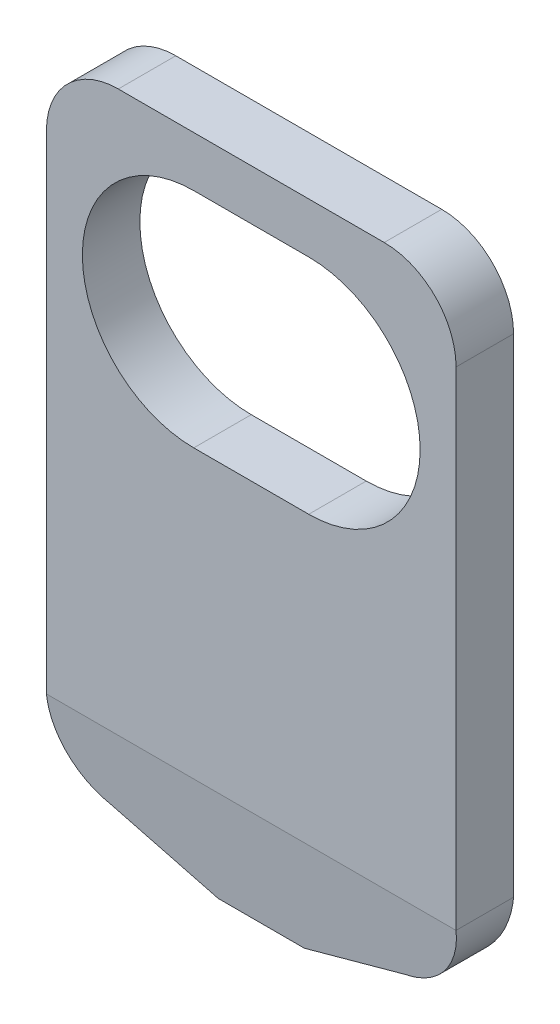
ISO-10303-21;
HEADER;
FILE_DESCRIPTION(('STEP AP214'),'2;1');
FILE_NAME('part.step','',(''),(''),'','','');
FILE_SCHEMA(('AUTOMOTIVE_DESIGN { 1 0 10303 214 1 1 1 1 }'));
ENDSEC;
DATA;
#1=APPLICATION_CONTEXT('core data for automotive mechanical design processes');
#2=APPLICATION_PROTOCOL_DEFINITION('international standard','automotive_design',2000,#1);
#3=PRODUCT_CONTEXT('',#1,'mechanical');
#4=PRODUCT('Part','Part','',(#3));
#5=PRODUCT_RELATED_PRODUCT_CATEGORY('part','',(#4));
#6=PRODUCT_DEFINITION_FORMATION('','',#4);
#7=PRODUCT_DEFINITION_CONTEXT('part definition',#1,'design');
#8=PRODUCT_DEFINITION('design','',#6,#7);
#9=PRODUCT_DEFINITION_SHAPE('','',#8);
#10=(LENGTH_UNIT() NAMED_UNIT(*) SI_UNIT(.MILLI.,.METRE.));
#11=(NAMED_UNIT(*) PLANE_ANGLE_UNIT() SI_UNIT($,.RADIAN.));
#12=(NAMED_UNIT(*) SI_UNIT($,.STERADIAN.) SOLID_ANGLE_UNIT());
#13=UNCERTAINTY_MEASURE_WITH_UNIT(LENGTH_MEASURE(1.E-05),#10,'distance_accuracy_value','');
#14=(GEOMETRIC_REPRESENTATION_CONTEXT(3) GLOBAL_UNCERTAINTY_ASSIGNED_CONTEXT((#13)) GLOBAL_UNIT_ASSIGNED_CONTEXT((#10,
#11,#12)) REPRESENTATION_CONTEXT('',''));
#15=CARTESIAN_POINT('',(0.,0.,0.));
#16=DIRECTION('',(0.,0.,1.));
#17=DIRECTION('',(1.,0.,0.));
#18=AXIS2_PLACEMENT_3D('',#15,#16,#17);
#19=CARTESIAN_POINT('',(5.,7.05077941637888,4.));
#20=DIRECTION('',(0.,0.,-1.));
#21=DIRECTION('',(-1.,0.,0.));
#22=AXIS2_PLACEMENT_3D('',#19,#20,#21);
#23=CYLINDRICAL_SURFACE('',#22,5.);
#24=DIRECTION('',(0.,0.,-1.));
#25=VECTOR('',#24,1.);
#26=CARTESIAN_POINT('',(0.,7.05077941637888,4.));
#27=LINE('',#26,#25);
#28=CARTESIAN_POINT('',(0.,7.05077941637888,4.));
#29=VERTEX_POINT('',#28);
#30=CARTESIAN_POINT('',(0.,7.05077941637888,0.));
#31=VERTEX_POINT('',#30);
#32=EDGE_CURVE('E245',#29,#31,#27,.T.);
#33=ORIENTED_EDGE('',*,*,#32,.T.);
#34=CARTESIAN_POINT('',(5.,7.05077941637888,0.));
#35=DIRECTION('',(0.,0.0987941169734353,0.995107894879464));
#36=DIRECTION('',(0.,0.995107894879464,-0.0987941169734353));
#37=AXIS2_PLACEMENT_3D('',#34,#35,#36);
#38=ELLIPSE('',#37,5.02458077734942,5.);
#39=CARTESIAN_POINT('',(3.96263798515156,2.15957506058372,0.48559781080416));
#40=VERTEX_POINT('',#39);
#41=EDGE_CURVE('E188',#31,#40,#38,.T.);
#42=ORIENTED_EDGE('',*,*,#41,.T.);
#43=DIRECTION('',(0.,0.,-1.));
#44=VECTOR('',#43,1.);
#45=CARTESIAN_POINT('',(3.96263798515156,2.15957506058372,4.));
#46=LINE('',#45,#44);
#47=CARTESIAN_POINT('',(3.96263798515156,2.15957506058372,3.51440218919584));
#48=VERTEX_POINT('',#47);
#49=EDGE_CURVE('E12',#48,#40,#46,.T.);
#50=ORIENTED_EDGE('',*,*,#49,.F.);
#51=CARTESIAN_POINT('',(5.,7.05077941637888,4.));
#52=DIRECTION('',(0.,0.0987941169734353,-0.995107894879464));
#53=DIRECTION('',(0.,-0.995107894879464,-0.0987941169734353));
#54=AXIS2_PLACEMENT_3D('',#51,#52,#53);
#55=ELLIPSE('',#54,5.02458077734942,5.);
#56=EDGE_CURVE('E296',#48,#29,#55,.T.);
#57=ORIENTED_EDGE('',*,*,#56,.T.);
#58=EDGE_LOOP('',(#33,#42,#50,#57));
#59=FACE_BOUND('',#58,.T.);
#60=ADVANCED_FACE('F81',(#59),#23,.T.);
#61=CARTESIAN_POINT('',(3.96263798515156,2.15957506058372,4.));
#62=DIRECTION('',(0.284131470503692,0.958785329189704,0.));
#63=DIRECTION('',(-0.958785329189704,0.284131470503692,0.));
#64=AXIS2_PLACEMENT_3D('',#61,#62,#63);
#65=PLANE('',#64);
#66=ORIENTED_EDGE('',*,*,#49,.T.);
#67=DIRECTION('',(0.958404094160579,-0.284018493316688,0.0281973004090641));
#68=VECTOR('',#67,1.);
#69=CARTESIAN_POINT('',(4.05761262433786,2.13142977814039,0.488392068934624));
#70=LINE('',#69,#68);
#71=CARTESIAN_POINT('',(11.25,0.,0.7));
#72=VERTEX_POINT('',#71);
#73=EDGE_CURVE('E279',#40,#72,#70,.T.);
#74=ORIENTED_EDGE('',*,*,#73,.T.);
#75=DIRECTION('',(0.,0.,-1.));
#76=VECTOR('',#75,1.);
#77=CARTESIAN_POINT('',(11.25,0.,4.));
#78=LINE('',#77,#76);
#79=CARTESIAN_POINT('',(11.25,0.,3.3));
#80=VERTEX_POINT('',#79);
#81=EDGE_CURVE('E89',#80,#72,#78,.T.);
#82=ORIENTED_EDGE('',*,*,#81,.F.);
#83=DIRECTION('',(-0.958404094160579,0.284018493316688,0.0281973004090642));
#84=VECTOR('',#83,1.);
#85=CARTESIAN_POINT('',(3.94951499171257,2.16346399725152,3.51478828206681));
#86=LINE('',#85,#84);
#87=EDGE_CURVE('E277',#80,#48,#86,.T.);
#88=ORIENTED_EDGE('',*,*,#87,.T.);
#89=EDGE_LOOP('',(#66,#74,#82,#88));
#90=FACE_BOUND('',#89,.T.);
#91=ADVANCED_FACE('F276',(#90),#65,.F.);
#92=CARTESIAN_POINT('',(11.25,0.,4.));
#93=DIRECTION('',(0.,1.,0.));
#94=DIRECTION('',(-1.,0.,0.));
#95=AXIS2_PLACEMENT_3D('',#92,#93,#94);
#96=PLANE('',#95);
#97=ORIENTED_EDGE('',*,*,#81,.T.);
#98=DIRECTION('',(-1.,0.,0.));
#99=VECTOR('',#98,1.);
#100=CARTESIAN_POINT('',(28.5,0.,0.7));
#101=LINE('',#100,#99);
#102=CARTESIAN_POINT('',(17.25,0.,0.7));
#103=VERTEX_POINT('',#102);
#104=EDGE_CURVE('E194',#103,#72,#101,.T.);
#105=ORIENTED_EDGE('',*,*,#104,.F.);
#106=DIRECTION('',(0.,0.,-1.));
#107=VECTOR('',#106,1.);
#108=CARTESIAN_POINT('',(17.25,0.,4.));
#109=LINE('',#108,#107);
#110=CARTESIAN_POINT('',(17.25,0.,3.3));
#111=VERTEX_POINT('',#110);
#112=EDGE_CURVE('E261',#111,#103,#109,.T.);
#113=ORIENTED_EDGE('',*,*,#112,.F.);
#114=DIRECTION('',(-1.,0.,0.));
#115=VECTOR('',#114,1.);
#116=CARTESIAN_POINT('',(28.5,0.,3.3));
#117=LINE('',#116,#115);
#118=EDGE_CURVE('E272',#111,#80,#117,.T.);
#119=ORIENTED_EDGE('',*,*,#118,.T.);
#120=EDGE_LOOP('',(#97,#105,#113,#119));
#121=FACE_BOUND('',#120,.T.);
#122=ADVANCED_FACE('F270',(#121),#96,.F.);
#123=CARTESIAN_POINT('',(17.25,0.,4.));
#124=DIRECTION('',(-0.284131470503692,0.958785329189704,0.));
#125=DIRECTION('',(-0.958785329189704,-0.284131470503692,0.));
#126=AXIS2_PLACEMENT_3D('',#123,#124,#125);
#127=PLANE('',#126);
#128=ORIENTED_EDGE('',*,*,#112,.T.);
#129=DIRECTION('',(0.958404094160579,0.284018493316687,-0.0281973004090641));
#130=VECTOR('',#129,1.);
#131=CARTESIAN_POINT('',(17.1608194530841,-0.0264282307666742,0.702623789576185));
#132=LINE('',#131,#130);
#133=CARTESIAN_POINT('',(24.5373620148484,2.15957506058372,0.48559781080416));
#134=VERTEX_POINT('',#133);
#135=EDGE_CURVE('E207',#103,#134,#132,.T.);
#136=ORIENTED_EDGE('',*,*,#135,.T.);
#137=DIRECTION('',(0.,0.,-1.));
#138=VECTOR('',#137,1.);
#139=CARTESIAN_POINT('',(24.5373620148484,2.15957506058372,4.));
#140=LINE('',#139,#138);
#141=CARTESIAN_POINT('',(24.5373620148484,2.15957506058372,3.51440218919584));
#142=VERTEX_POINT('',#141);
#143=EDGE_CURVE('E205',#142,#134,#140,.T.);
#144=ORIENTED_EDGE('',*,*,#143,.F.);
#145=DIRECTION('',(-0.958404094160579,-0.284018493316687,-0.0281973004090641));
#146=VECTOR('',#145,1.);
#147=CARTESIAN_POINT('',(17.2689170857094,0.00560598834444739,3.30055656142525));
#148=LINE('',#147,#146);
#149=EDGE_CURVE('E290',#142,#111,#148,.T.);
#150=ORIENTED_EDGE('',*,*,#149,.T.);
#151=EDGE_LOOP('',(#128,#136,#144,#150));
#152=FACE_BOUND('',#151,.T.);
#153=ADVANCED_FACE('F390',(#152),#127,.F.);
#154=CARTESIAN_POINT('',(23.5,7.05077941637888,4.));
#155=DIRECTION('',(0.,0.,-1.));
#156=DIRECTION('',(-1.,0.,0.));
#157=AXIS2_PLACEMENT_3D('',#154,#155,#156);
#158=CYLINDRICAL_SURFACE('',#157,5.);
#159=CARTESIAN_POINT('',(23.5,7.05077941637888,0.));
#160=DIRECTION('',(0.,0.0987941169734353,0.995107894879464));
#161=DIRECTION('',(0.,0.995107894879464,-0.0987941169734353));
#162=AXIS2_PLACEMENT_3D('',#159,#160,#161);
#163=ELLIPSE('',#162,5.02458077734942,5.);
#164=CARTESIAN_POINT('',(28.5,7.05077941637888,0.));
#165=VERTEX_POINT('',#164);
#166=EDGE_CURVE('E185',#165,#134,#163,.F.);
#167=ORIENTED_EDGE('',*,*,#166,.F.);
#168=DIRECTION('',(0.,0.,-1.));
#169=VECTOR('',#168,1.);
#170=CARTESIAN_POINT('',(28.5,7.05077941637888,4.));
#171=LINE('',#170,#169);
#172=CARTESIAN_POINT('',(28.5,7.05077941637888,4.));
#173=VERTEX_POINT('',#172);
#174=EDGE_CURVE('E202',#173,#165,#171,.T.);
#175=ORIENTED_EDGE('',*,*,#174,.F.);
#176=CARTESIAN_POINT('',(23.5,7.05077941637888,4.));
#177=DIRECTION('',(0.,0.0987941169734353,-0.995107894879464));
#178=DIRECTION('',(0.,-0.995107894879464,-0.0987941169734353));
#179=AXIS2_PLACEMENT_3D('',#176,#177,#178);
#180=ELLIPSE('',#179,5.02458077734942,5.);
#181=EDGE_CURVE('E284',#142,#173,#180,.F.);
#182=ORIENTED_EDGE('',*,*,#181,.F.);
#183=ORIENTED_EDGE('',*,*,#143,.T.);
#184=EDGE_LOOP('',(#167,#175,#182,#183));
#185=FACE_BOUND('',#184,.T.);
#186=ADVANCED_FACE('F200',(#185),#158,.T.);
#187=CARTESIAN_POINT('',(28.5,7.05077941637888,4.));
#188=DIRECTION('',(-1.,0.,0.));
#189=DIRECTION('',(0.,0.,1.));
#190=AXIS2_PLACEMENT_3D('',#187,#188,#189);
#191=PLANE('',#190);
#192=DIRECTION('',(0.,1.,0.));
#193=VECTOR('',#192,1.);
#194=CARTESIAN_POINT('',(28.5,7.05077941637888,0.));
#195=LINE('',#194,#193);
#196=CARTESIAN_POINT('',(28.5,41.,0.));
#197=VERTEX_POINT('',#196);
#198=EDGE_CURVE('E212',#165,#197,#195,.T.);
#199=ORIENTED_EDGE('',*,*,#198,.T.);
#200=DIRECTION('',(0.,0.,-1.));
#201=VECTOR('',#200,1.);
#202=CARTESIAN_POINT('',(28.5,41.,4.));
#203=LINE('',#202,#201);
#204=CARTESIAN_POINT('',(28.5,41.,4.));
#205=VERTEX_POINT('',#204);
#206=EDGE_CURVE('E216',#205,#197,#203,.T.);
#207=ORIENTED_EDGE('',*,*,#206,.F.);
#208=DIRECTION('',(0.,1.,0.));
#209=VECTOR('',#208,1.);
#210=CARTESIAN_POINT('',(28.5,7.05077941637888,4.));
#211=LINE('',#210,#209);
#212=EDGE_CURVE('E214',#173,#205,#211,.T.);
#213=ORIENTED_EDGE('',*,*,#212,.F.);
#214=ORIENTED_EDGE('',*,*,#174,.T.);
#215=EDGE_LOOP('',(#199,#207,#213,#214));
#216=FACE_BOUND('',#215,.T.);
#217=ADVANCED_FACE('F210',(#216),#191,.F.);
#218=CARTESIAN_POINT('',(23.5,41.,4.));
#219=DIRECTION('',(0.,0.,-1.));
#220=DIRECTION('',(-1.,0.,0.));
#221=AXIS2_PLACEMENT_3D('',#218,#219,#220);
#222=CYLINDRICAL_SURFACE('',#221,5.);
#223=CARTESIAN_POINT('',(23.5,41.,0.));
#224=DIRECTION('',(0.,0.,1.));
#225=DIRECTION('',(1.,0.,0.));
#226=AXIS2_PLACEMENT_3D('',#223,#224,#225);
#227=CIRCLE('',#226,5.);
#228=CARTESIAN_POINT('',(23.5,46.,0.));
#229=VERTEX_POINT('',#228);
#230=EDGE_CURVE('E222',#197,#229,#227,.T.);
#231=ORIENTED_EDGE('',*,*,#230,.T.);
#232=DIRECTION('',(0.,0.,-1.));
#233=VECTOR('',#232,1.);
#234=CARTESIAN_POINT('',(23.5,46.,4.));
#235=LINE('',#234,#233);
#236=CARTESIAN_POINT('',(23.5,46.,4.));
#237=VERTEX_POINT('',#236);
#238=EDGE_CURVE('E254',#237,#229,#235,.T.);
#239=ORIENTED_EDGE('',*,*,#238,.F.);
#240=CARTESIAN_POINT('',(23.5,41.,4.));
#241=DIRECTION('',(0.,0.,1.));
#242=DIRECTION('',(1.,0.,0.));
#243=AXIS2_PLACEMENT_3D('',#240,#241,#242);
#244=CIRCLE('',#243,5.);
#245=EDGE_CURVE('E336',#205,#237,#244,.T.);
#246=ORIENTED_EDGE('',*,*,#245,.F.);
#247=ORIENTED_EDGE('',*,*,#206,.T.);
#248=EDGE_LOOP('',(#231,#239,#246,#247));
#249=FACE_BOUND('',#248,.T.);
#250=ADVANCED_FACE('F374',(#249),#222,.T.);
#251=CARTESIAN_POINT('',(5.,46.,4.));
#252=DIRECTION('',(0.,1.,0.));
#253=DIRECTION('',(0.,0.,1.));
#254=AXIS2_PLACEMENT_3D('',#251,#252,#253);
#255=PLANE('',#254);
#256=DIRECTION('',(1.,0.,0.));
#257=VECTOR('',#256,1.);
#258=CARTESIAN_POINT('',(5.,46.,0.));
#259=LINE('',#258,#257);
#260=CARTESIAN_POINT('',(5.,46.,0.));
#261=VERTEX_POINT('',#260);
#262=EDGE_CURVE('E228',#261,#229,#259,.T.);
#263=ORIENTED_EDGE('',*,*,#262,.F.);
#264=DIRECTION('',(0.,0.,-1.));
#265=VECTOR('',#264,1.);
#266=CARTESIAN_POINT('',(5.,46.,4.));
#267=LINE('',#266,#265);
#268=CARTESIAN_POINT('',(5.,46.,4.));
#269=VERTEX_POINT('',#268);
#270=EDGE_CURVE('E251',#269,#261,#267,.T.);
#271=ORIENTED_EDGE('',*,*,#270,.F.);
#272=DIRECTION('',(1.,0.,0.));
#273=VECTOR('',#272,1.);
#274=CARTESIAN_POINT('',(5.,46.,4.));
#275=LINE('',#274,#273);
#276=EDGE_CURVE('E339',#269,#237,#275,.T.);
#277=ORIENTED_EDGE('',*,*,#276,.T.);
#278=ORIENTED_EDGE('',*,*,#238,.T.);
#279=EDGE_LOOP('',(#263,#271,#277,#278));
#280=FACE_BOUND('',#279,.T.);
#281=ADVANCED_FACE('F365',(#280),#255,.T.);
#282=CARTESIAN_POINT('',(5.,41.,4.));
#283=DIRECTION('',(0.,0.,-1.));
#284=DIRECTION('',(-1.,0.,0.));
#285=AXIS2_PLACEMENT_3D('',#282,#283,#284);
#286=CYLINDRICAL_SURFACE('',#285,5.);
#287=CARTESIAN_POINT('',(5.,41.,0.));
#288=DIRECTION('',(0.,0.,-1.));
#289=DIRECTION('',(-1.,0.,0.));
#290=AXIS2_PLACEMENT_3D('',#287,#288,#289);
#291=CIRCLE('',#290,5.);
#292=CARTESIAN_POINT('',(0.,41.,0.));
#293=VERTEX_POINT('',#292);
#294=EDGE_CURVE('E238',#293,#261,#291,.T.);
#295=ORIENTED_EDGE('',*,*,#294,.F.);
#296=DIRECTION('',(0.,0.,-1.));
#297=VECTOR('',#296,1.);
#298=CARTESIAN_POINT('',(0.,41.,4.));
#299=LINE('',#298,#297);
#300=CARTESIAN_POINT('',(0.,41.,4.));
#301=VERTEX_POINT('',#300);
#302=EDGE_CURVE('E248',#301,#293,#299,.T.);
#303=ORIENTED_EDGE('',*,*,#302,.F.);
#304=CARTESIAN_POINT('',(5.,41.,4.));
#305=DIRECTION('',(0.,0.,-1.));
#306=DIRECTION('',(-1.,0.,0.));
#307=AXIS2_PLACEMENT_3D('',#304,#305,#306);
#308=CIRCLE('',#307,5.);
#309=EDGE_CURVE('E342',#301,#269,#308,.T.);
#310=ORIENTED_EDGE('',*,*,#309,.T.);
#311=ORIENTED_EDGE('',*,*,#270,.T.);
#312=EDGE_LOOP('',(#295,#303,#310,#311));
#313=FACE_BOUND('',#312,.T.);
#314=ADVANCED_FACE('F366',(#313),#286,.T.);
#315=CARTESIAN_POINT('',(0.,7.05077941637888,4.));
#316=DIRECTION('',(-1.,0.,0.));
#317=DIRECTION('',(0.,0.,1.));
#318=AXIS2_PLACEMENT_3D('',#315,#316,#317);
#319=PLANE('',#318);
#320=DIRECTION('',(0.,1.,0.));
#321=VECTOR('',#320,1.);
#322=CARTESIAN_POINT('',(0.,7.05077941637888,0.));
#323=LINE('',#322,#321);
#324=EDGE_CURVE('E242',#31,#293,#323,.T.);
#325=ORIENTED_EDGE('',*,*,#324,.F.);
#326=ORIENTED_EDGE('',*,*,#32,.F.);
#327=DIRECTION('',(0.,1.,0.));
#328=VECTOR('',#327,1.);
#329=CARTESIAN_POINT('',(0.,7.05077941637888,4.));
#330=LINE('',#329,#328);
#331=EDGE_CURVE('E233',#29,#301,#330,.T.);
#332=ORIENTED_EDGE('',*,*,#331,.T.);
#333=ORIENTED_EDGE('',*,*,#302,.T.);
#334=EDGE_LOOP('',(#325,#326,#332,#333));
#335=FACE_BOUND('',#334,.T.);
#336=ADVANCED_FACE('F353',(#335),#319,.T.);
#337=CARTESIAN_POINT('',(5.,7.05077941637888,4.));
#338=DIRECTION('',(0.,0.,1.));
#339=DIRECTION('',(1.,0.,0.));
#340=AXIS2_PLACEMENT_3D('',#337,#338,#339);
#341=PLANE('',#340);
#342=DIRECTION('',(-1.,0.,0.));
#343=VECTOR('',#342,1.);
#344=CARTESIAN_POINT('',(28.5,7.05077941637888,4.));
#345=LINE('',#344,#343);
#346=EDGE_CURVE('E359',#173,#29,#345,.T.);
#347=ORIENTED_EDGE('',*,*,#346,.F.);
#348=ORIENTED_EDGE('',*,*,#212,.T.);
#349=ORIENTED_EDGE('',*,*,#245,.T.);
#350=ORIENTED_EDGE('',*,*,#276,.F.);
#351=ORIENTED_EDGE('',*,*,#309,.F.);
#352=ORIENTED_EDGE('',*,*,#331,.F.);
#353=EDGE_LOOP('',(#347,#348,#349,#350,#351,#352));
#354=FACE_BOUND('',#353,.T.);
#355=DIRECTION('',(1.,0.,0.));
#356=VECTOR('',#355,1.);
#357=CARTESIAN_POINT('',(10.25,42.5,4.));
#358=LINE('',#357,#356);
#359=CARTESIAN_POINT('',(10.25,42.5,4.));
#360=VERTEX_POINT('',#359);
#361=CARTESIAN_POINT('',(18.25,42.5,4.));
#362=VERTEX_POINT('',#361);
#363=EDGE_CURVE('E300',#360,#362,#358,.T.);
#364=ORIENTED_EDGE('',*,*,#363,.T.);
#365=CARTESIAN_POINT('',(18.25,34.75,4.));
#366=DIRECTION('',(0.,0.,-1.));
#367=DIRECTION('',(-1.,0.,0.));
#368=AXIS2_PLACEMENT_3D('',#365,#366,#367);
#369=CIRCLE('',#368,7.75);
#370=CARTESIAN_POINT('',(18.25,27.,4.));
#371=VERTEX_POINT('',#370);
#372=EDGE_CURVE('E304',#362,#371,#369,.T.);
#373=ORIENTED_EDGE('',*,*,#372,.T.);
#374=DIRECTION('',(1.,0.,0.));
#375=VECTOR('',#374,1.);
#376=CARTESIAN_POINT('',(10.25,27.,4.));
#377=LINE('',#376,#375);
#378=CARTESIAN_POINT('',(10.25,27.,4.));
#379=VERTEX_POINT('',#378);
#380=EDGE_CURVE('E309',#379,#371,#377,.T.);
#381=ORIENTED_EDGE('',*,*,#380,.F.);
#382=CARTESIAN_POINT('',(10.25,34.75,4.));
#383=DIRECTION('',(0.,0.,1.));
#384=DIRECTION('',(1.,0.,0.));
#385=AXIS2_PLACEMENT_3D('',#382,#383,#384);
#386=CIRCLE('',#385,7.75);
#387=EDGE_CURVE('E312',#360,#379,#386,.T.);
#388=ORIENTED_EDGE('',*,*,#387,.F.);
#389=EDGE_LOOP('',(#364,#373,#381,#388));
#390=FACE_BOUND('',#389,.T.);
#391=ADVANCED_FACE('F357',(#354,#390),#341,.T.);
#392=CARTESIAN_POINT('',(5.,7.05077941637888,0.));
#393=DIRECTION('',(0.,0.,1.));
#394=DIRECTION('',(1.,0.,0.));
#395=AXIS2_PLACEMENT_3D('',#392,#393,#394);
#396=PLANE('',#395);
#397=CARTESIAN_POINT('',(18.25,34.75,0.));
#398=DIRECTION('',(0.,0.,-1.));
#399=DIRECTION('',(-1.,0.,0.));
#400=AXIS2_PLACEMENT_3D('',#397,#398,#399);
#401=CIRCLE('',#400,7.75);
#402=CARTESIAN_POINT('',(18.25,42.5,0.));
#403=VERTEX_POINT('',#402);
#404=CARTESIAN_POINT('',(18.25,27.,0.));
#405=VERTEX_POINT('',#404);
#406=EDGE_CURVE('E318',#403,#405,#401,.T.);
#407=ORIENTED_EDGE('',*,*,#406,.F.);
#408=DIRECTION('',(1.,0.,0.));
#409=VECTOR('',#408,1.);
#410=CARTESIAN_POINT('',(10.25,42.5,0.));
#411=LINE('',#410,#409);
#412=CARTESIAN_POINT('',(10.25,42.5,0.));
#413=VERTEX_POINT('',#412);
#414=EDGE_CURVE('E104',#413,#403,#411,.T.);
#415=ORIENTED_EDGE('',*,*,#414,.F.);
#416=CARTESIAN_POINT('',(10.25,34.75,0.));
#417=DIRECTION('',(0.,0.,1.));
#418=DIRECTION('',(1.,0.,0.));
#419=AXIS2_PLACEMENT_3D('',#416,#417,#418);
#420=CIRCLE('',#419,7.75);
#421=CARTESIAN_POINT('',(10.25,27.,0.));
#422=VERTEX_POINT('',#421);
#423=EDGE_CURVE('E305',#413,#422,#420,.T.);
#424=ORIENTED_EDGE('',*,*,#423,.T.);
#425=DIRECTION('',(1.,0.,0.));
#426=VECTOR('',#425,1.);
#427=CARTESIAN_POINT('',(10.25,27.,0.));
#428=LINE('',#427,#426);
#429=EDGE_CURVE('E321',#422,#405,#428,.T.);
#430=ORIENTED_EDGE('',*,*,#429,.T.);
#431=EDGE_LOOP('',(#407,#415,#424,#430));
#432=FACE_BOUND('',#431,.T.);
#433=ORIENTED_EDGE('',*,*,#198,.F.);
#434=DIRECTION('',(-1.,0.,0.));
#435=VECTOR('',#434,1.);
#436=CARTESIAN_POINT('',(28.5,7.05077941637888,0.));
#437=LINE('',#436,#435);
#438=EDGE_CURVE('E182',#165,#31,#437,.T.);
#439=ORIENTED_EDGE('',*,*,#438,.T.);
#440=ORIENTED_EDGE('',*,*,#324,.T.);
#441=ORIENTED_EDGE('',*,*,#294,.T.);
#442=ORIENTED_EDGE('',*,*,#262,.T.);
#443=ORIENTED_EDGE('',*,*,#230,.F.);
#444=EDGE_LOOP('',(#433,#439,#440,#441,#442,#443));
#445=FACE_BOUND('',#444,.T.);
#446=ADVANCED_FACE('F219',(#432,#445),#396,.F.);
#447=CARTESIAN_POINT('',(10.25,42.5,4.));
#448=DIRECTION('',(0.,1.,0.));
#449=DIRECTION('',(0.,0.,1.));
#450=AXIS2_PLACEMENT_3D('',#447,#448,#449);
#451=PLANE('',#450);
#452=ORIENTED_EDGE('',*,*,#414,.T.);
#453=DIRECTION('',(0.,0.,-1.));
#454=VECTOR('',#453,1.);
#455=CARTESIAN_POINT('',(18.25,42.5,4.));
#456=LINE('',#455,#454);
#457=EDGE_CURVE('E315',#362,#403,#456,.T.);
#458=ORIENTED_EDGE('',*,*,#457,.F.);
#459=ORIENTED_EDGE('',*,*,#363,.F.);
#460=DIRECTION('',(0.,0.,-1.));
#461=VECTOR('',#460,1.);
#462=CARTESIAN_POINT('',(10.25,42.5,4.));
#463=LINE('',#462,#461);
#464=EDGE_CURVE('E224',#360,#413,#463,.T.);
#465=ORIENTED_EDGE('',*,*,#464,.T.);
#466=EDGE_LOOP('',(#452,#458,#459,#465));
#467=FACE_BOUND('',#466,.T.);
#468=ADVANCED_FACE('F422',(#467),#451,.F.);
#469=CARTESIAN_POINT('',(10.25,34.75,4.));
#470=DIRECTION('',(0.,0.,-1.));
#471=DIRECTION('',(-1.,0.,0.));
#472=AXIS2_PLACEMENT_3D('',#469,#470,#471);
#473=CYLINDRICAL_SURFACE('',#472,7.75);
#474=ORIENTED_EDGE('',*,*,#423,.F.);
#475=ORIENTED_EDGE('',*,*,#464,.F.);
#476=ORIENTED_EDGE('',*,*,#387,.T.);
#477=DIRECTION('',(0.,0.,-1.));
#478=VECTOR('',#477,1.);
#479=CARTESIAN_POINT('',(10.25,27.,4.));
#480=LINE('',#479,#478);
#481=EDGE_CURVE('E230',#379,#422,#480,.T.);
#482=ORIENTED_EDGE('',*,*,#481,.T.);
#483=EDGE_LOOP('',(#474,#475,#476,#482));
#484=FACE_BOUND('',#483,.T.);
#485=ADVANCED_FACE('F427',(#484),#473,.F.);
#486=CARTESIAN_POINT('',(10.25,27.,4.));
#487=DIRECTION('',(0.,1.,0.));
#488=DIRECTION('',(0.,0.,1.));
#489=AXIS2_PLACEMENT_3D('',#486,#487,#488);
#490=PLANE('',#489);
#491=ORIENTED_EDGE('',*,*,#429,.F.);
#492=ORIENTED_EDGE('',*,*,#481,.F.);
#493=ORIENTED_EDGE('',*,*,#380,.T.);
#494=DIRECTION('',(0.,0.,-1.));
#495=VECTOR('',#494,1.);
#496=CARTESIAN_POINT('',(18.25,27.,4.));
#497=LINE('',#496,#495);
#498=EDGE_CURVE('E96',#371,#405,#497,.T.);
#499=ORIENTED_EDGE('',*,*,#498,.T.);
#500=EDGE_LOOP('',(#491,#492,#493,#499));
#501=FACE_BOUND('',#500,.T.);
#502=ADVANCED_FACE('F438',(#501),#490,.T.);
#503=CARTESIAN_POINT('',(18.25,34.75,4.));
#504=DIRECTION('',(0.,0.,-1.));
#505=DIRECTION('',(-1.,0.,0.));
#506=AXIS2_PLACEMENT_3D('',#503,#504,#505);
#507=CYLINDRICAL_SURFACE('',#506,7.75);
#508=ORIENTED_EDGE('',*,*,#406,.T.);
#509=ORIENTED_EDGE('',*,*,#498,.F.);
#510=ORIENTED_EDGE('',*,*,#372,.F.);
#511=ORIENTED_EDGE('',*,*,#457,.T.);
#512=EDGE_LOOP('',(#508,#509,#510,#511));
#513=FACE_BOUND('',#512,.T.);
#514=ADVANCED_FACE('F448',(#513),#507,.F.);
#515=CARTESIAN_POINT('',(28.5,7.05077941637888,0.));
#516=DIRECTION('',(0.,0.0987941169734353,0.995107894879464));
#517=DIRECTION('',(0.,-0.995107894879464,0.0987941169734353));
#518=AXIS2_PLACEMENT_3D('',#515,#516,#517);
#519=PLANE('',#518);
#520=ORIENTED_EDGE('',*,*,#438,.F.);
#521=ORIENTED_EDGE('',*,*,#166,.T.);
#522=ORIENTED_EDGE('',*,*,#135,.F.);
#523=ORIENTED_EDGE('',*,*,#104,.T.);
#524=ORIENTED_EDGE('',*,*,#73,.F.);
#525=ORIENTED_EDGE('',*,*,#41,.F.);
#526=EDGE_LOOP('',(#520,#521,#522,#523,#524,#525));
#527=FACE_BOUND('',#526,.T.);
#528=ADVANCED_FACE('F184',(#527),#519,.F.);
#529=CARTESIAN_POINT('',(28.5,7.05077941637888,4.));
#530=DIRECTION('',(0.,0.0987941169734353,-0.995107894879464));
#531=DIRECTION('',(0.,0.995107894879464,0.0987941169734353));
#532=AXIS2_PLACEMENT_3D('',#529,#530,#531);
#533=PLANE('',#532);
#534=ORIENTED_EDGE('',*,*,#87,.F.);
#535=ORIENTED_EDGE('',*,*,#118,.F.);
#536=ORIENTED_EDGE('',*,*,#149,.F.);
#537=ORIENTED_EDGE('',*,*,#181,.T.);
#538=ORIENTED_EDGE('',*,*,#346,.T.);
#539=ORIENTED_EDGE('',*,*,#56,.F.);
#540=EDGE_LOOP('',(#534,#535,#536,#537,#538,#539));
#541=FACE_BOUND('',#540,.T.);
#542=ADVANCED_FACE('F382',(#541),#533,.F.);
#543=CLOSED_SHELL('',(#60,#91,#122,#153,#186,#217,#250,#281,#314,#336,#391,#446,#468,#485,#502,
#514,#528,#542));
#544=MANIFOLD_SOLID_BREP('B2',#543);
#545=ADVANCED_BREP_SHAPE_REPRESENTATION('',(#18,#544),#14);
#546=SHAPE_DEFINITION_REPRESENTATION(#9,#545);
ENDSEC;
END-ISO-10303-21;
